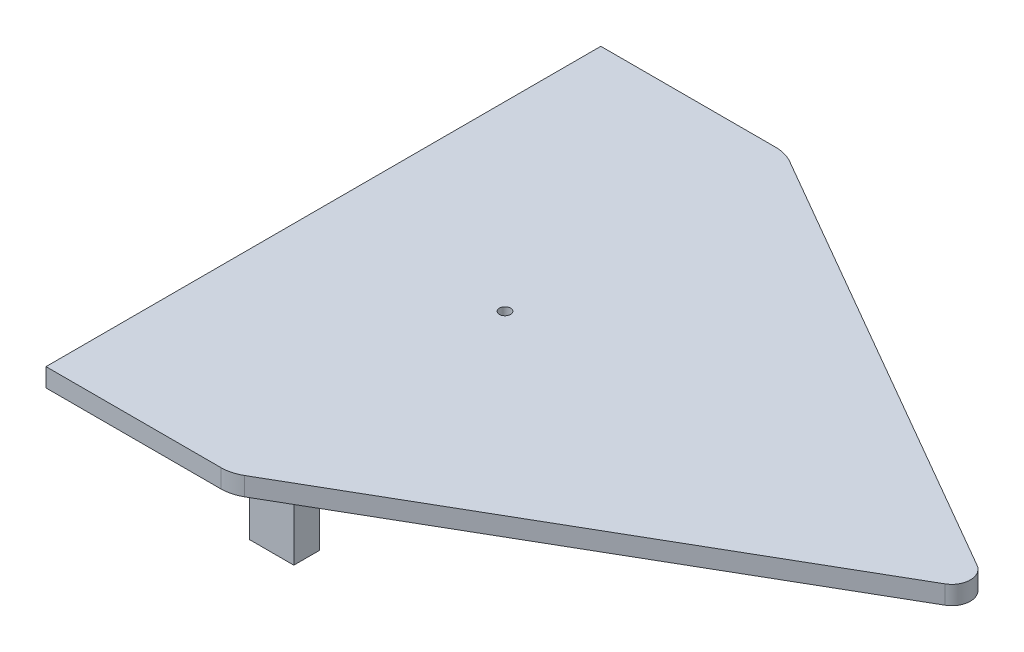
ISO-10303-21;
HEADER;
FILE_DESCRIPTION(('STEP AP214'),'2;1');
FILE_NAME('part.step','',(''),(''),'','','');
FILE_SCHEMA(('AUTOMOTIVE_DESIGN { 1 0 10303 214 1 1 1 1 }'));
ENDSEC;
DATA;
#1=APPLICATION_CONTEXT('core data for automotive mechanical design processes');
#2=APPLICATION_PROTOCOL_DEFINITION('international standard','automotive_design',2000,#1);
#3=PRODUCT_CONTEXT('',#1,'mechanical');
#4=PRODUCT('Part','Part','',(#3));
#5=PRODUCT_RELATED_PRODUCT_CATEGORY('part','',(#4));
#6=PRODUCT_DEFINITION_FORMATION('','',#4);
#7=PRODUCT_DEFINITION_CONTEXT('part definition',#1,'design');
#8=PRODUCT_DEFINITION('design','',#6,#7);
#9=PRODUCT_DEFINITION_SHAPE('','',#8);
#10=(LENGTH_UNIT() NAMED_UNIT(*) SI_UNIT(.MILLI.,.METRE.));
#11=(NAMED_UNIT(*) PLANE_ANGLE_UNIT() SI_UNIT($,.RADIAN.));
#12=(NAMED_UNIT(*) SI_UNIT($,.STERADIAN.) SOLID_ANGLE_UNIT());
#13=UNCERTAINTY_MEASURE_WITH_UNIT(LENGTH_MEASURE(1.E-05),#10,'distance_accuracy_value','');
#14=(GEOMETRIC_REPRESENTATION_CONTEXT(3) GLOBAL_UNCERTAINTY_ASSIGNED_CONTEXT((#13)) GLOBAL_UNIT_ASSIGNED_CONTEXT((#10,
#11,#12)) REPRESENTATION_CONTEXT('',''));
#15=CARTESIAN_POINT('',(0.,0.,0.));
#16=DIRECTION('',(0.,0.,1.));
#17=DIRECTION('',(1.,0.,0.));
#18=AXIS2_PLACEMENT_3D('',#15,#16,#17);
#19=CARTESIAN_POINT('',(-89.8482755730144,-48.,28.));
#20=DIRECTION('',(0.,0.,-1.));
#21=DIRECTION('',(-1.,0.,0.));
#22=AXIS2_PLACEMENT_3D('',#19,#20,#21);
#23=PLANE('',#22);
#24=DIRECTION('',(-1.,0.,0.));
#25=VECTOR('',#24,1.);
#26=CARTESIAN_POINT('',(-89.8482755730144,-18.,28.));
#27=LINE('',#26,#25);
#28=CARTESIAN_POINT('',(-81.8482755730144,-18.,28.));
#29=VERTEX_POINT('',#28);
#30=CARTESIAN_POINT('',(-85.8482755730144,-18.,28.));
#31=VERTEX_POINT('',#30);
#32=EDGE_CURVE('E11',#29,#31,#27,.T.);
#33=ORIENTED_EDGE('',*,*,#32,.T.);
#34=DIRECTION('',(0.,-1.,0.));
#35=VECTOR('',#34,1.);
#36=CARTESIAN_POINT('',(-85.8482755730144,-48.,28.));
#37=LINE('',#36,#35);
#38=CARTESIAN_POINT('',(-85.8482755730144,-48.,28.));
#39=VERTEX_POINT('',#38);
#40=EDGE_CURVE('E245',#31,#39,#37,.T.);
#41=ORIENTED_EDGE('',*,*,#40,.T.);
#42=DIRECTION('',(-1.,0.,0.));
#43=VECTOR('',#42,1.);
#44=CARTESIAN_POINT('',(-89.8482755730144,-48.,28.));
#45=LINE('',#44,#43);
#46=CARTESIAN_POINT('',(-89.8482755730144,-48.,28.));
#47=VERTEX_POINT('',#46);
#48=EDGE_CURVE('E252',#39,#47,#45,.T.);
#49=ORIENTED_EDGE('',*,*,#48,.T.);
#50=DIRECTION('',(0.,1.,0.));
#51=VECTOR('',#50,1.);
#52=CARTESIAN_POINT('',(-89.8482755730144,-48.,28.));
#53=LINE('',#52,#51);
#54=CARTESIAN_POINT('',(-89.8482755730144,-10.,28.));
#55=VERTEX_POINT('',#54);
#56=EDGE_CURVE('E270',#47,#55,#53,.T.);
#57=ORIENTED_EDGE('',*,*,#56,.T.);
#58=DIRECTION('',(-1.,0.,0.));
#59=VECTOR('',#58,1.);
#60=CARTESIAN_POINT('',(-89.8482755730144,-10.,28.));
#61=LINE('',#60,#59);
#62=CARTESIAN_POINT('',(-77.8482755730144,-10.,28.));
#63=VERTEX_POINT('',#62);
#64=EDGE_CURVE('E426',#55,#63,#61,.F.);
#65=ORIENTED_EDGE('',*,*,#64,.T.);
#66=DIRECTION('',(0.,1.,0.));
#67=VECTOR('',#66,1.);
#68=CARTESIAN_POINT('',(-77.8482755730144,-48.,28.));
#69=LINE('',#68,#67);
#70=CARTESIAN_POINT('',(-77.8482755730144,-48.,28.));
#71=VERTEX_POINT('',#70);
#72=EDGE_CURVE('E267',#71,#63,#69,.T.);
#73=ORIENTED_EDGE('',*,*,#72,.F.);
#74=CARTESIAN_POINT('',(-81.8482755730144,-48.,28.));
#75=VERTEX_POINT('',#74);
#76=EDGE_CURVE('E254',#71,#75,#45,.T.);
#77=ORIENTED_EDGE('',*,*,#76,.T.);
#78=DIRECTION('',(0.,1.,0.));
#79=VECTOR('',#78,1.);
#80=CARTESIAN_POINT('',(-81.8482755730144,-48.,28.));
#81=LINE('',#80,#79);
#82=EDGE_CURVE('E47',#75,#29,#81,.T.);
#83=ORIENTED_EDGE('',*,*,#82,.T.);
#84=EDGE_LOOP('',(#33,#41,#49,#57,#65,#73,#77,#83));
#85=FACE_BOUND('',#84,.T.);
#86=ADVANCED_FACE('F32',(#85),#23,.T.);
#87=CARTESIAN_POINT('',(0.,-48.,0.));
#88=DIRECTION('',(0.,1.,0.));
#89=DIRECTION('',(0.,0.,-1.));
#90=AXIS2_PLACEMENT_3D('',#87,#88,#89);
#91=PLANE('',#90);
#92=DIRECTION('',(0.,0.,-1.));
#93=VECTOR('',#92,1.);
#94=CARTESIAN_POINT('',(-85.8482755730144,-48.,0.));
#95=LINE('',#94,#93);
#96=CARTESIAN_POINT('',(-85.8482755730144,-48.,31.));
#97=VERTEX_POINT('',#96);
#98=EDGE_CURVE('E40',#97,#39,#95,.T.);
#99=ORIENTED_EDGE('',*,*,#98,.F.);
#100=DIRECTION('',(1.,0.,0.));
#101=VECTOR('',#100,1.);
#102=CARTESIAN_POINT('',(-85.8482755730144,-48.,31.));
#103=LINE('',#102,#101);
#104=CARTESIAN_POINT('',(-81.8482755730144,-48.,31.));
#105=VERTEX_POINT('',#104);
#106=EDGE_CURVE('E238',#97,#105,#103,.T.);
#107=ORIENTED_EDGE('',*,*,#106,.T.);
#108=DIRECTION('',(0.,0.,-1.));
#109=VECTOR('',#108,1.);
#110=CARTESIAN_POINT('',(-81.8482755730144,-48.,27.));
#111=LINE('',#110,#109);
#112=EDGE_CURVE('E232',#105,#75,#111,.T.);
#113=ORIENTED_EDGE('',*,*,#112,.T.);
#114=ORIENTED_EDGE('',*,*,#76,.F.);
#115=DIRECTION('',(0.,0.,-1.));
#116=VECTOR('',#115,1.);
#117=CARTESIAN_POINT('',(-77.8482755730144,-48.,35.));
#118=LINE('',#117,#116);
#119=CARTESIAN_POINT('',(-77.8482755730144,-48.,35.));
#120=VERTEX_POINT('',#119);
#121=EDGE_CURVE('E257',#120,#71,#118,.T.);
#122=ORIENTED_EDGE('',*,*,#121,.F.);
#123=DIRECTION('',(1.,0.,0.));
#124=VECTOR('',#123,1.);
#125=CARTESIAN_POINT('',(-89.8482755730144,-48.,35.));
#126=LINE('',#125,#124);
#127=CARTESIAN_POINT('',(-89.8482755730144,-48.,35.));
#128=VERTEX_POINT('',#127);
#129=EDGE_CURVE('E260',#128,#120,#126,.T.);
#130=ORIENTED_EDGE('',*,*,#129,.F.);
#131=DIRECTION('',(0.,0.,1.));
#132=VECTOR('',#131,1.);
#133=CARTESIAN_POINT('',(-89.8482755730144,-48.,35.));
#134=LINE('',#133,#132);
#135=EDGE_CURVE('E249',#47,#128,#134,.T.);
#136=ORIENTED_EDGE('',*,*,#135,.F.);
#137=ORIENTED_EDGE('',*,*,#48,.F.);
#138=EDGE_LOOP('',(#99,#107,#113,#114,#122,#130,#136,#137));
#139=FACE_BOUND('',#138,.T.);
#140=ADVANCED_FACE('F449',(#139),#91,.F.);
#141=CARTESIAN_POINT('',(0.,0.,0.));
#142=DIRECTION('',(0.,1.,0.));
#143=DIRECTION('',(0.,0.,1.));
#144=AXIS2_PLACEMENT_3D('',#141,#142,#143);
#145=PLANE('',#144);
#146=DIRECTION('',(0.,0.,-1.));
#147=VECTOR('',#146,1.);
#148=CARTESIAN_POINT('',(-67.8482755730145,0.,0.));
#149=LINE('',#148,#147);
#150=CARTESIAN_POINT('',(-67.8482755730145,0.,45.));
#151=VERTEX_POINT('',#150);
#152=CARTESIAN_POINT('',(-67.8482755730145,0.,18.));
#153=VERTEX_POINT('',#152);
#154=EDGE_CURVE('E421',#151,#153,#149,.T.);
#155=ORIENTED_EDGE('',*,*,#154,.T.);
#156=DIRECTION('',(-1.,0.,0.));
#157=VECTOR('',#156,1.);
#158=CARTESIAN_POINT('',(0.,0.,18.));
#159=LINE('',#158,#157);
#160=CARTESIAN_POINT('',(-99.8482755730144,0.,18.));
#161=VERTEX_POINT('',#160);
#162=EDGE_CURVE('E423',#153,#161,#159,.T.);
#163=ORIENTED_EDGE('',*,*,#162,.T.);
#164=DIRECTION('',(0.,0.,1.));
#165=VECTOR('',#164,1.);
#166=CARTESIAN_POINT('',(-99.8482755730144,0.,0.));
#167=LINE('',#166,#165);
#168=CARTESIAN_POINT('',(-99.8482755730144,0.,45.));
#169=VERTEX_POINT('',#168);
#170=EDGE_CURVE('E419',#161,#169,#167,.T.);
#171=ORIENTED_EDGE('',*,*,#170,.T.);
#172=DIRECTION('',(1.,0.,0.));
#173=VECTOR('',#172,1.);
#174=CARTESIAN_POINT('',(0.,0.,45.));
#175=LINE('',#174,#173);
#176=EDGE_CURVE('E417',#169,#151,#175,.T.);
#177=ORIENTED_EDGE('',*,*,#176,.T.);
#178=EDGE_LOOP('',(#155,#163,#171,#177));
#179=FACE_BOUND('',#178,.T.);
#180=DIRECTION('',(0.,0.,-1.));
#181=VECTOR('',#180,1.);
#182=CARTESIAN_POINT('',(-99.8482755730144,0.,-28.));
#183=LINE('',#182,#181);
#184=CARTESIAN_POINT('',(-99.8482755730144,0.,-45.));
#185=VERTEX_POINT('',#184);
#186=CARTESIAN_POINT('',(-99.8482755730144,0.,-18.));
#187=VERTEX_POINT('',#186);
#188=EDGE_CURVE('E391',#185,#187,#183,.F.);
#189=ORIENTED_EDGE('',*,*,#188,.T.);
#190=DIRECTION('',(-1.,0.,0.));
#191=VECTOR('',#190,1.);
#192=CARTESIAN_POINT('',(-77.8482755730144,0.,-18.));
#193=LINE('',#192,#191);
#194=CARTESIAN_POINT('',(-67.8482755730145,0.,-18.));
#195=VERTEX_POINT('',#194);
#196=EDGE_CURVE('E395',#187,#195,#193,.F.);
#197=ORIENTED_EDGE('',*,*,#196,.T.);
#198=DIRECTION('',(0.,0.,1.));
#199=VECTOR('',#198,1.);
#200=CARTESIAN_POINT('',(-67.8482755730145,0.,-35.));
#201=LINE('',#200,#199);
#202=CARTESIAN_POINT('',(-67.8482755730145,0.,-45.));
#203=VERTEX_POINT('',#202);
#204=EDGE_CURVE('E393',#195,#203,#201,.F.);
#205=ORIENTED_EDGE('',*,*,#204,.T.);
#206=DIRECTION('',(1.,0.,0.));
#207=VECTOR('',#206,1.);
#208=CARTESIAN_POINT('',(-89.8482755730144,0.,-45.));
#209=LINE('',#208,#207);
#210=EDGE_CURVE('E389',#203,#185,#209,.F.);
#211=ORIENTED_EDGE('',*,*,#210,.T.);
#212=EDGE_LOOP('',(#189,#197,#205,#211));
#213=FACE_BOUND('',#212,.T.);
#214=DIRECTION('',(0.866025403784438,0.,-0.5));
#215=VECTOR('',#214,1.);
#216=CARTESIAN_POINT('',(-54.8482755730144,0.,75.));
#217=LINE('',#216,#215);
#218=CARTESIAN_POINT('',(-52.5277674973257,0.,73.6602540378444));
#219=VERTEX_POINT('',#218);
#220=CARTESIAN_POINT('',(67.5555349946513,0.,4.3301270189222));
#221=VERTEX_POINT('',#220);
#222=EDGE_CURVE('E332',#219,#221,#217,.T.);
#223=ORIENTED_EDGE('',*,*,#222,.F.);
#224=CARTESIAN_POINT('',(-57.5277674973257,0.,65.));
#225=DIRECTION('',(0.,1.,0.));
#226=DIRECTION('',(0.,0.,1.));
#227=AXIS2_PLACEMENT_3D('',#224,#225,#226);
#228=CIRCLE('',#227,10.);
#229=CARTESIAN_POINT('',(-57.5277674973257,0.,75.));
#230=VERTEX_POINT('',#229);
#231=EDGE_CURVE('E380',#219,#230,#228,.F.);
#232=ORIENTED_EDGE('',*,*,#231,.T.);
#233=DIRECTION('',(-1.,0.,0.));
#234=VECTOR('',#233,1.);
#235=CARTESIAN_POINT('',(-54.8482755730144,0.,75.));
#236=LINE('',#235,#234);
#237=CARTESIAN_POINT('',(-104.848275573014,0.,75.));
#238=VERTEX_POINT('',#237);
#239=EDGE_CURVE('E349',#230,#238,#236,.T.);
#240=ORIENTED_EDGE('',*,*,#239,.T.);
#241=DIRECTION('',(0.,0.,1.));
#242=VECTOR('',#241,1.);
#243=CARTESIAN_POINT('',(-104.848275573014,0.,-75.));
#244=LINE('',#243,#242);
#245=CARTESIAN_POINT('',(-104.848275573014,0.,-75.));
#246=VERTEX_POINT('',#245);
#247=EDGE_CURVE('E346',#246,#238,#244,.T.);
#248=ORIENTED_EDGE('',*,*,#247,.F.);
#249=DIRECTION('',(-1.,0.,0.));
#250=VECTOR('',#249,1.);
#251=CARTESIAN_POINT('',(-54.8482755730144,0.,-75.));
#252=LINE('',#251,#250);
#253=CARTESIAN_POINT('',(-57.5277674973257,0.,-75.));
#254=VERTEX_POINT('',#253);
#255=EDGE_CURVE('E344',#254,#246,#252,.T.);
#256=ORIENTED_EDGE('',*,*,#255,.F.);
#257=CARTESIAN_POINT('',(-57.5277674973257,0.,-65.));
#258=DIRECTION('',(0.,1.,0.));
#259=DIRECTION('',(0.,0.,1.));
#260=AXIS2_PLACEMENT_3D('',#257,#258,#259);
#261=CIRCLE('',#260,10.);
#262=CARTESIAN_POINT('',(-52.5277674973257,0.,-73.6602540378444));
#263=VERTEX_POINT('',#262);
#264=EDGE_CURVE('E371',#254,#263,#261,.F.);
#265=ORIENTED_EDGE('',*,*,#264,.T.);
#266=DIRECTION('',(-0.866025403784439,0.,-0.5));
#267=VECTOR('',#266,1.);
#268=CARTESIAN_POINT('',(75.0555349946513,0.,0.));
#269=LINE('',#268,#267);
#270=CARTESIAN_POINT('',(67.5555349946514,0.,-4.33012701892219));
#271=VERTEX_POINT('',#270);
#272=EDGE_CURVE('E325',#271,#263,#269,.T.);
#273=ORIENTED_EDGE('',*,*,#272,.F.);
#274=CARTESIAN_POINT('',(65.0555349946513,0.,0.));
#275=DIRECTION('',(0.,1.,0.));
#276=DIRECTION('',(0.,0.,1.));
#277=AXIS2_PLACEMENT_3D('',#274,#275,#276);
#278=CIRCLE('',#277,5.);
#279=EDGE_CURVE('E360',#271,#221,#278,.F.);
#280=ORIENTED_EDGE('',*,*,#279,.T.);
#281=EDGE_LOOP('',(#223,#232,#240,#248,#256,#265,#273,#280));
#282=FACE_BOUND('',#281,.T.);
#283=ADVANCED_FACE('F468',(#179,#213,#282),#145,.F.);
#284=CARTESIAN_POINT('',(75.0555349946513,5.,0.));
#285=DIRECTION('',(-0.5,0.,0.866025403784439));
#286=DIRECTION('',(0.866025403784439,0.,0.5));
#287=AXIS2_PLACEMENT_3D('',#284,#285,#286);
#288=PLANE('',#287);
#289=ORIENTED_EDGE('',*,*,#272,.T.);
#290=DIRECTION('',(0.,-1.,0.));
#291=VECTOR('',#290,1.);
#292=CARTESIAN_POINT('',(-52.5277674973257,5.,-73.6602540378444));
#293=LINE('',#292,#291);
#294=CARTESIAN_POINT('',(-52.5277674973257,5.,-73.6602540378444));
#295=VERTEX_POINT('',#294);
#296=EDGE_CURVE('E373',#263,#295,#293,.F.);
#297=ORIENTED_EDGE('',*,*,#296,.T.);
#298=DIRECTION('',(-0.866025403784439,0.,-0.5));
#299=VECTOR('',#298,1.);
#300=CARTESIAN_POINT('',(75.0555349946513,5.,0.));
#301=LINE('',#300,#299);
#302=CARTESIAN_POINT('',(67.5555349946514,5.,-4.33012701892219));
#303=VERTEX_POINT('',#302);
#304=EDGE_CURVE('E328',#303,#295,#301,.T.);
#305=ORIENTED_EDGE('',*,*,#304,.F.);
#306=DIRECTION('',(0.,-1.,0.));
#307=VECTOR('',#306,1.);
#308=CARTESIAN_POINT('',(67.5555349946514,5.,-4.33012701892219));
#309=LINE('',#308,#307);
#310=EDGE_CURVE('E357',#303,#271,#309,.T.);
#311=ORIENTED_EDGE('',*,*,#310,.T.);
#312=EDGE_LOOP('',(#289,#297,#305,#311));
#313=FACE_BOUND('',#312,.T.);
#314=ADVANCED_FACE('F549',(#313),#288,.F.);
#315=CARTESIAN_POINT('',(-54.8482755730144,5.,-75.));
#316=DIRECTION('',(0.,0.,1.));
#317=DIRECTION('',(1.,0.,0.));
#318=AXIS2_PLACEMENT_3D('',#315,#316,#317);
#319=PLANE('',#318);
#320=DIRECTION('',(-1.,0.,0.));
#321=VECTOR('',#320,1.);
#322=CARTESIAN_POINT('',(-54.8482755730144,5.,-75.));
#323=LINE('',#322,#321);
#324=CARTESIAN_POINT('',(-57.5277674973257,5.,-75.));
#325=VERTEX_POINT('',#324);
#326=CARTESIAN_POINT('',(-104.848275573014,5.,-75.));
#327=VERTEX_POINT('',#326);
#328=EDGE_CURVE('E331',#325,#327,#323,.T.);
#329=ORIENTED_EDGE('',*,*,#328,.F.);
#330=DIRECTION('',(0.,-1.,0.));
#331=VECTOR('',#330,1.);
#332=CARTESIAN_POINT('',(-57.5277674973257,5.,-75.));
#333=LINE('',#332,#331);
#334=EDGE_CURVE('E368',#325,#254,#333,.T.);
#335=ORIENTED_EDGE('',*,*,#334,.T.);
#336=ORIENTED_EDGE('',*,*,#255,.T.);
#337=DIRECTION('',(0.,-1.,0.));
#338=VECTOR('',#337,1.);
#339=CARTESIAN_POINT('',(-104.848275573014,5.,-75.));
#340=LINE('',#339,#338);
#341=EDGE_CURVE('E354',#327,#246,#340,.T.);
#342=ORIENTED_EDGE('',*,*,#341,.F.);
#343=EDGE_LOOP('',(#329,#335,#336,#342));
#344=FACE_BOUND('',#343,.T.);
#345=ADVANCED_FACE('F560',(#344),#319,.F.);
#346=CARTESIAN_POINT('',(-104.848275573014,5.,-75.));
#347=DIRECTION('',(1.,0.,0.));
#348=DIRECTION('',(0.,0.,-1.));
#349=AXIS2_PLACEMENT_3D('',#346,#347,#348);
#350=PLANE('',#349);
#351=ORIENTED_EDGE('',*,*,#247,.T.);
#352=DIRECTION('',(0.,-1.,0.));
#353=VECTOR('',#352,1.);
#354=CARTESIAN_POINT('',(-104.848275573014,5.,75.));
#355=LINE('',#354,#353);
#356=CARTESIAN_POINT('',(-104.848275573014,5.,75.));
#357=VERTEX_POINT('',#356);
#358=EDGE_CURVE('E341',#357,#238,#355,.T.);
#359=ORIENTED_EDGE('',*,*,#358,.F.);
#360=DIRECTION('',(0.,0.,1.));
#361=VECTOR('',#360,1.);
#362=CARTESIAN_POINT('',(-104.848275573014,5.,-75.));
#363=LINE('',#362,#361);
#364=EDGE_CURVE('E334',#327,#357,#363,.T.);
#365=ORIENTED_EDGE('',*,*,#364,.F.);
#366=ORIENTED_EDGE('',*,*,#341,.T.);
#367=EDGE_LOOP('',(#351,#359,#365,#366));
#368=FACE_BOUND('',#367,.T.);
#369=ADVANCED_FACE('F556',(#368),#350,.F.);
#370=CARTESIAN_POINT('',(-54.8482755730144,5.,75.));
#371=DIRECTION('',(0.,0.,1.));
#372=DIRECTION('',(1.,0.,0.));
#373=AXIS2_PLACEMENT_3D('',#370,#371,#372);
#374=PLANE('',#373);
#375=ORIENTED_EDGE('',*,*,#239,.F.);
#376=DIRECTION('',(0.,-1.,0.));
#377=VECTOR('',#376,1.);
#378=CARTESIAN_POINT('',(-57.5277674973257,5.,75.));
#379=LINE('',#378,#377);
#380=CARTESIAN_POINT('',(-57.5277674973257,5.,75.));
#381=VERTEX_POINT('',#380);
#382=EDGE_CURVE('E382',#230,#381,#379,.F.);
#383=ORIENTED_EDGE('',*,*,#382,.T.);
#384=DIRECTION('',(-1.,0.,0.));
#385=VECTOR('',#384,1.);
#386=CARTESIAN_POINT('',(-54.8482755730144,5.,75.));
#387=LINE('',#386,#385);
#388=EDGE_CURVE('E337',#381,#357,#387,.T.);
#389=ORIENTED_EDGE('',*,*,#388,.T.);
#390=ORIENTED_EDGE('',*,*,#358,.T.);
#391=EDGE_LOOP('',(#375,#383,#389,#390));
#392=FACE_BOUND('',#391,.T.);
#393=ADVANCED_FACE('F552',(#392),#374,.T.);
#394=CARTESIAN_POINT('',(-54.8482755730144,5.,75.));
#395=DIRECTION('',(-0.5,0.,-0.866025403784439));
#396=DIRECTION('',(-0.866025403784439,0.,0.5));
#397=AXIS2_PLACEMENT_3D('',#394,#395,#396);
#398=PLANE('',#397);
#399=DIRECTION('',(0.866025403784438,0.,-0.5));
#400=VECTOR('',#399,1.);
#401=CARTESIAN_POINT('',(-54.8482755730144,5.,75.));
#402=LINE('',#401,#400);
#403=CARTESIAN_POINT('',(-52.5277674973257,5.,73.6602540378444));
#404=VERTEX_POINT('',#403);
#405=CARTESIAN_POINT('',(67.5555349946513,5.,4.3301270189222));
#406=VERTEX_POINT('',#405);
#407=EDGE_CURVE('E339',#404,#406,#402,.T.);
#408=ORIENTED_EDGE('',*,*,#407,.F.);
#409=DIRECTION('',(0.,-1.,0.));
#410=VECTOR('',#409,1.);
#411=CARTESIAN_POINT('',(-52.5277674973257,0.,73.6602540378444));
#412=LINE('',#411,#410);
#413=EDGE_CURVE('E377',#404,#219,#412,.T.);
#414=ORIENTED_EDGE('',*,*,#413,.T.);
#415=ORIENTED_EDGE('',*,*,#222,.T.);
#416=DIRECTION('',(0.,-1.,0.));
#417=VECTOR('',#416,1.);
#418=CARTESIAN_POINT('',(67.5555349946514,5.,4.33012701892217));
#419=LINE('',#418,#417);
#420=EDGE_CURVE('E363',#221,#406,#419,.F.);
#421=ORIENTED_EDGE('',*,*,#420,.T.);
#422=EDGE_LOOP('',(#408,#414,#415,#421));
#423=FACE_BOUND('',#422,.T.);
#424=ADVANCED_FACE('F545',(#423),#398,.F.);
#425=CARTESIAN_POINT('',(0.,5.,0.));
#426=DIRECTION('',(0.,1.,0.));
#427=DIRECTION('',(0.,0.,1.));
#428=AXIS2_PLACEMENT_3D('',#425,#426,#427);
#429=PLANE('',#428);
#430=CARTESIAN_POINT('',(-55.7544650053487,5.,0.));
#431=DIRECTION('',(0.,1.,0.));
#432=DIRECTION('',(0.,0.,1.));
#433=AXIS2_PLACEMENT_3D('',#430,#431,#432);
#434=CIRCLE('',#433,1.5);
#435=CARTESIAN_POINT('',(-55.7544650053487,5.,1.50000000000001));
#436=VERTEX_POINT('',#435);
#437=EDGE_CURVE('E321',#436,#436,#434,.T.);
#438=ORIENTED_EDGE('',*,*,#437,.F.);
#439=EDGE_LOOP('',(#438));
#440=FACE_BOUND('',#439,.T.);
#441=ORIENTED_EDGE('',*,*,#388,.F.);
#442=CARTESIAN_POINT('',(-57.5277674973257,5.,65.));
#443=DIRECTION('',(0.,1.,0.));
#444=DIRECTION('',(0.,0.,1.));
#445=AXIS2_PLACEMENT_3D('',#442,#443,#444);
#446=CIRCLE('',#445,10.);
#447=EDGE_CURVE('E384',#381,#404,#446,.T.);
#448=ORIENTED_EDGE('',*,*,#447,.T.);
#449=ORIENTED_EDGE('',*,*,#407,.T.);
#450=CARTESIAN_POINT('',(65.0555349946513,5.,0.));
#451=DIRECTION('',(0.,1.,0.));
#452=DIRECTION('',(0.,0.,1.));
#453=AXIS2_PLACEMENT_3D('',#450,#451,#452);
#454=CIRCLE('',#453,5.);
#455=EDGE_CURVE('E366',#406,#303,#454,.T.);
#456=ORIENTED_EDGE('',*,*,#455,.T.);
#457=ORIENTED_EDGE('',*,*,#304,.T.);
#458=CARTESIAN_POINT('',(-57.5277674973257,5.,-65.));
#459=DIRECTION('',(0.,1.,0.));
#460=DIRECTION('',(0.,0.,1.));
#461=AXIS2_PLACEMENT_3D('',#458,#459,#460);
#462=CIRCLE('',#461,10.);
#463=EDGE_CURVE('E375',#295,#325,#462,.T.);
#464=ORIENTED_EDGE('',*,*,#463,.T.);
#465=ORIENTED_EDGE('',*,*,#328,.T.);
#466=ORIENTED_EDGE('',*,*,#364,.T.);
#467=EDGE_LOOP('',(#441,#448,#449,#456,#457,#464,#465,#466));
#468=FACE_BOUND('',#467,.T.);
#469=ADVANCED_FACE('F541',(#440,#468),#429,.T.);
#470=CARTESIAN_POINT('',(65.0555349946513,5.,0.));
#471=DIRECTION('',(0.,-1.,0.));
#472=DIRECTION('',(0.,0.,-1.));
#473=AXIS2_PLACEMENT_3D('',#470,#471,#472);
#474=CYLINDRICAL_SURFACE('',#473,5.);
#475=ORIENTED_EDGE('',*,*,#455,.F.);
#476=ORIENTED_EDGE('',*,*,#420,.F.);
#477=ORIENTED_EDGE('',*,*,#279,.F.);
#478=ORIENTED_EDGE('',*,*,#310,.F.);
#479=EDGE_LOOP('',(#475,#476,#477,#478));
#480=FACE_BOUND('',#479,.T.);
#481=ADVANCED_FACE('F544',(#480),#474,.T.);
#482=CARTESIAN_POINT('',(-57.5277674973257,5.,-65.));
#483=DIRECTION('',(0.,-1.,0.));
#484=DIRECTION('',(0.,0.,-1.));
#485=AXIS2_PLACEMENT_3D('',#482,#483,#484);
#486=CYLINDRICAL_SURFACE('',#485,10.);
#487=ORIENTED_EDGE('',*,*,#463,.F.);
#488=ORIENTED_EDGE('',*,*,#296,.F.);
#489=ORIENTED_EDGE('',*,*,#264,.F.);
#490=ORIENTED_EDGE('',*,*,#334,.F.);
#491=EDGE_LOOP('',(#487,#488,#489,#490));
#492=FACE_BOUND('',#491,.T.);
#493=ADVANCED_FACE('F570',(#492),#486,.T.);
#494=CARTESIAN_POINT('',(-57.5277674973257,5.,65.));
#495=DIRECTION('',(0.,1.,0.));
#496=DIRECTION('',(0.,0.,1.));
#497=AXIS2_PLACEMENT_3D('',#494,#495,#496);
#498=CYLINDRICAL_SURFACE('',#497,10.);
#499=ORIENTED_EDGE('',*,*,#447,.F.);
#500=ORIENTED_EDGE('',*,*,#382,.F.);
#501=ORIENTED_EDGE('',*,*,#231,.F.);
#502=ORIENTED_EDGE('',*,*,#413,.F.);
#503=EDGE_LOOP('',(#499,#500,#501,#502));
#504=FACE_BOUND('',#503,.T.);
#505=ADVANCED_FACE('F539',(#504),#498,.T.);
#506=CARTESIAN_POINT('',(-55.7544650053487,1.5,0.));
#507=DIRECTION('',(0.,1.,0.));
#508=DIRECTION('',(0.,0.,1.));
#509=AXIS2_PLACEMENT_3D('',#506,#507,#508);
#510=CYLINDRICAL_SURFACE('',#509,1.5);
#511=CARTESIAN_POINT('',(-55.7544650053487,1.5,0.));
#512=DIRECTION('',(0.,1.,0.));
#513=DIRECTION('',(0.,0.,1.));
#514=AXIS2_PLACEMENT_3D('',#511,#512,#513);
#515=CIRCLE('',#514,1.5);
#516=CARTESIAN_POINT('',(-55.7544650053487,1.5,1.50000000000001));
#517=VERTEX_POINT('',#516);
#518=EDGE_CURVE('E322',#517,#517,#515,.T.);
#519=ORIENTED_EDGE('',*,*,#518,.F.);
#520=EDGE_LOOP('',(#519));
#521=FACE_BOUND('',#520,.T.);
#522=ORIENTED_EDGE('',*,*,#437,.T.);
#523=EDGE_LOOP('',(#522));
#524=FACE_BOUND('',#523,.T.);
#525=ADVANCED_FACE('F535',(#521,#524),#510,.F.);
#526=CARTESIAN_POINT('',(-55.7544650053487,1.5,0.));
#527=DIRECTION('',(0.,1.,0.));
#528=DIRECTION('',(0.,0.,1.));
#529=AXIS2_PLACEMENT_3D('',#526,#527,#528);
#530=PLANE('',#529);
#531=ORIENTED_EDGE('',*,*,#518,.T.);
#532=EDGE_LOOP('',(#531));
#533=FACE_BOUND('',#532,.T.);
#534=ADVANCED_FACE('F531',(#533),#530,.T.);
#535=CARTESIAN_POINT('',(-89.8482755730144,-48.,-35.));
#536=DIRECTION('',(1.,0.,0.));
#537=DIRECTION('',(0.,0.,-1.));
#538=AXIS2_PLACEMENT_3D('',#535,#536,#537);
#539=PLANE('',#538);
#540=DIRECTION('',(0.,1.,0.));
#541=VECTOR('',#540,1.);
#542=CARTESIAN_POINT('',(-89.8482755730144,-48.,-28.));
#543=LINE('',#542,#541);
#544=CARTESIAN_POINT('',(-89.8482755730144,-48.,-28.));
#545=VERTEX_POINT('',#544);
#546=CARTESIAN_POINT('',(-89.8482755730144,-10.,-28.));
#547=VERTEX_POINT('',#546);
#548=EDGE_CURVE('E309',#545,#547,#543,.T.);
#549=ORIENTED_EDGE('',*,*,#548,.T.);
#550=DIRECTION('',(0.,0.,-1.));
#551=VECTOR('',#550,1.);
#552=CARTESIAN_POINT('',(-89.8482755730144,-10.,-35.));
#553=LINE('',#552,#551);
#554=CARTESIAN_POINT('',(-89.8482755730144,-10.,-35.));
#555=VERTEX_POINT('',#554);
#556=EDGE_CURVE('E400',#547,#555,#553,.T.);
#557=ORIENTED_EDGE('',*,*,#556,.T.);
#558=DIRECTION('',(0.,1.,0.));
#559=VECTOR('',#558,1.);
#560=CARTESIAN_POINT('',(-89.8482755730144,-48.,-35.));
#561=LINE('',#560,#559);
#562=CARTESIAN_POINT('',(-89.8482755730144,-48.,-35.));
#563=VERTEX_POINT('',#562);
#564=EDGE_CURVE('E318',#563,#555,#561,.T.);
#565=ORIENTED_EDGE('',*,*,#564,.F.);
#566=DIRECTION('',(0.,0.,-1.));
#567=VECTOR('',#566,1.);
#568=CARTESIAN_POINT('',(-89.8482755730144,-48.,-35.));
#569=LINE('',#568,#567);
#570=EDGE_CURVE('E297',#545,#563,#569,.T.);
#571=ORIENTED_EDGE('',*,*,#570,.F.);
#572=EDGE_LOOP('',(#549,#557,#565,#571));
#573=FACE_BOUND('',#572,.T.);
#574=ADVANCED_FACE('F527',(#573),#539,.F.);
#575=CARTESIAN_POINT('',(-89.8482755730144,-48.,-35.));
#576=DIRECTION('',(0.,0.,1.));
#577=DIRECTION('',(1.,0.,0.));
#578=AXIS2_PLACEMENT_3D('',#575,#576,#577);
#579=PLANE('',#578);
#580=ORIENTED_EDGE('',*,*,#564,.T.);
#581=DIRECTION('',(1.,0.,0.));
#582=VECTOR('',#581,1.);
#583=CARTESIAN_POINT('',(-77.8482755730144,-10.,-35.));
#584=LINE('',#583,#582);
#585=CARTESIAN_POINT('',(-77.8482755730144,-10.,-35.));
#586=VERTEX_POINT('',#585);
#587=EDGE_CURVE('E402',#555,#586,#584,.T.);
#588=ORIENTED_EDGE('',*,*,#587,.T.);
#589=DIRECTION('',(0.,1.,0.));
#590=VECTOR('',#589,1.);
#591=CARTESIAN_POINT('',(-77.8482755730144,-48.,-35.));
#592=LINE('',#591,#590);
#593=CARTESIAN_POINT('',(-77.8482755730144,-48.,-35.));
#594=VERTEX_POINT('',#593);
#595=EDGE_CURVE('E315',#594,#586,#592,.T.);
#596=ORIENTED_EDGE('',*,*,#595,.F.);
#597=DIRECTION('',(1.,0.,0.));
#598=VECTOR('',#597,1.);
#599=CARTESIAN_POINT('',(-89.8482755730144,-48.,-35.));
#600=LINE('',#599,#598);
#601=EDGE_CURVE('E300',#563,#594,#600,.T.);
#602=ORIENTED_EDGE('',*,*,#601,.F.);
#603=EDGE_LOOP('',(#580,#588,#596,#602));
#604=FACE_BOUND('',#603,.T.);
#605=ADVANCED_FACE('F523',(#604),#579,.F.);
#606=CARTESIAN_POINT('',(-77.8482755730144,-48.,-35.));
#607=DIRECTION('',(-1.,0.,0.));
#608=DIRECTION('',(0.,0.,1.));
#609=AXIS2_PLACEMENT_3D('',#606,#607,#608);
#610=PLANE('',#609);
#611=ORIENTED_EDGE('',*,*,#595,.T.);
#612=DIRECTION('',(0.,0.,1.));
#613=VECTOR('',#612,1.);
#614=CARTESIAN_POINT('',(-77.8482755730144,-10.,-28.));
#615=LINE('',#614,#613);
#616=CARTESIAN_POINT('',(-77.8482755730144,-10.,-28.));
#617=VERTEX_POINT('',#616);
#618=EDGE_CURVE('E398',#586,#617,#615,.T.);
#619=ORIENTED_EDGE('',*,*,#618,.T.);
#620=DIRECTION('',(0.,1.,0.));
#621=VECTOR('',#620,1.);
#622=CARTESIAN_POINT('',(-77.8482755730144,-48.,-28.));
#623=LINE('',#622,#621);
#624=CARTESIAN_POINT('',(-77.8482755730144,-48.,-28.));
#625=VERTEX_POINT('',#624);
#626=EDGE_CURVE('E312',#625,#617,#623,.T.);
#627=ORIENTED_EDGE('',*,*,#626,.F.);
#628=DIRECTION('',(0.,0.,1.));
#629=VECTOR('',#628,1.);
#630=CARTESIAN_POINT('',(-77.8482755730144,-48.,-35.));
#631=LINE('',#630,#629);
#632=EDGE_CURVE('E303',#594,#625,#631,.T.);
#633=ORIENTED_EDGE('',*,*,#632,.F.);
#634=EDGE_LOOP('',(#611,#619,#627,#633));
#635=FACE_BOUND('',#634,.T.);
#636=ADVANCED_FACE('F519',(#635),#610,.F.);
#637=CARTESIAN_POINT('',(-89.8482755730144,-48.,-28.));
#638=DIRECTION('',(0.,0.,-1.));
#639=DIRECTION('',(-1.,0.,0.));
#640=AXIS2_PLACEMENT_3D('',#637,#638,#639);
#641=PLANE('',#640);
#642=DIRECTION('',(-1.,0.,0.));
#643=VECTOR('',#642,1.);
#644=CARTESIAN_POINT('',(-89.8482755730144,-48.,-28.));
#645=LINE('',#644,#643);
#646=CARTESIAN_POINT('',(-85.8482755730144,-48.,-28.));
#647=VERTEX_POINT('',#646);
#648=EDGE_CURVE('E305',#647,#545,#645,.T.);
#649=ORIENTED_EDGE('',*,*,#648,.F.);
#650=DIRECTION('',(0.,1.,0.));
#651=VECTOR('',#650,1.);
#652=CARTESIAN_POINT('',(-85.8482755730144,-48.,-28.));
#653=LINE('',#652,#651);
#654=CARTESIAN_POINT('',(-85.8482755730144,-18.,-28.));
#655=VERTEX_POINT('',#654);
#656=EDGE_CURVE('E293',#647,#655,#653,.T.);
#657=ORIENTED_EDGE('',*,*,#656,.T.);
#658=DIRECTION('',(-1.,0.,0.));
#659=VECTOR('',#658,1.);
#660=CARTESIAN_POINT('',(-89.8482755730144,-18.,-28.));
#661=LINE('',#660,#659);
#662=CARTESIAN_POINT('',(-81.8482755730144,-18.,-28.));
#663=VERTEX_POINT('',#662);
#664=EDGE_CURVE('E415',#663,#655,#661,.T.);
#665=ORIENTED_EDGE('',*,*,#664,.F.);
#666=DIRECTION('',(0.,-1.,0.));
#667=VECTOR('',#666,1.);
#668=CARTESIAN_POINT('',(-81.8482755730144,-48.,-28.));
#669=LINE('',#668,#667);
#670=CARTESIAN_POINT('',(-81.8482755730144,-48.,-28.));
#671=VERTEX_POINT('',#670);
#672=EDGE_CURVE('E289',#663,#671,#669,.T.);
#673=ORIENTED_EDGE('',*,*,#672,.T.);
#674=EDGE_CURVE('E306',#625,#671,#645,.T.);
#675=ORIENTED_EDGE('',*,*,#674,.F.);
#676=ORIENTED_EDGE('',*,*,#626,.T.);
#677=DIRECTION('',(-1.,0.,0.));
#678=VECTOR('',#677,1.);
#679=CARTESIAN_POINT('',(-89.8482755730144,-10.,-28.));
#680=LINE('',#679,#678);
#681=EDGE_CURVE('E386',#617,#547,#680,.T.);
#682=ORIENTED_EDGE('',*,*,#681,.T.);
#683=ORIENTED_EDGE('',*,*,#548,.F.);
#684=EDGE_LOOP('',(#649,#657,#665,#673,#675,#676,#682,#683));
#685=FACE_BOUND('',#684,.T.);
#686=ADVANCED_FACE('F515',(#685),#641,.F.);
#687=CARTESIAN_POINT('',(0.,-48.,0.));
#688=DIRECTION('',(0.,1.,0.));
#689=DIRECTION('',(0.,0.,1.));
#690=AXIS2_PLACEMENT_3D('',#687,#688,#689);
#691=PLANE('',#690);
#692=DIRECTION('',(1.,0.,0.));
#693=VECTOR('',#692,1.);
#694=CARTESIAN_POINT('',(-85.8482755730144,-48.,-31.));
#695=LINE('',#694,#693);
#696=CARTESIAN_POINT('',(-85.8482755730144,-48.,-31.));
#697=VERTEX_POINT('',#696);
#698=CARTESIAN_POINT('',(-81.8482755730144,-48.,-31.));
#699=VERTEX_POINT('',#698);
#700=EDGE_CURVE('E273',#697,#699,#695,.T.);
#701=ORIENTED_EDGE('',*,*,#700,.F.);
#702=DIRECTION('',(0.,0.,1.));
#703=VECTOR('',#702,1.);
#704=CARTESIAN_POINT('',(-85.8482755730144,-48.,0.));
#705=LINE('',#704,#703);
#706=EDGE_CURVE('E404',#697,#647,#705,.T.);
#707=ORIENTED_EDGE('',*,*,#706,.T.);
#708=ORIENTED_EDGE('',*,*,#648,.T.);
#709=ORIENTED_EDGE('',*,*,#570,.T.);
#710=ORIENTED_EDGE('',*,*,#601,.T.);
#711=ORIENTED_EDGE('',*,*,#632,.T.);
#712=ORIENTED_EDGE('',*,*,#674,.T.);
#713=DIRECTION('',(0.,0.,1.));
#714=VECTOR('',#713,1.);
#715=CARTESIAN_POINT('',(-81.8482755730144,-48.,-27.));
#716=LINE('',#715,#714);
#717=EDGE_CURVE('E277',#699,#671,#716,.T.);
#718=ORIENTED_EDGE('',*,*,#717,.F.);
#719=EDGE_LOOP('',(#701,#707,#708,#709,#710,#711,#712,#718));
#720=FACE_BOUND('',#719,.T.);
#721=ADVANCED_FACE('F511',(#720),#691,.F.);
#722=CARTESIAN_POINT('',(-89.8482755730144,-10.,-45.));
#723=DIRECTION('',(-1.,0.,0.));
#724=DIRECTION('',(0.,0.,1.));
#725=AXIS2_PLACEMENT_3D('',#722,#723,#724);
#726=CYLINDRICAL_SURFACE('',#725,10.);
#727=CARTESIAN_POINT('',(-99.8482755730144,-10.,-45.));
#728=DIRECTION('',(-0.707106781186547,0.,0.707106781186547));
#729=DIRECTION('',(-0.707106781186547,0.,-0.707106781186547));
#730=AXIS2_PLACEMENT_3D('',#727,#728,#729);
#731=ELLIPSE('',#730,14.1421356237309,10.);
#732=EDGE_CURVE('E408',#185,#555,#731,.F.);
#733=ORIENTED_EDGE('',*,*,#732,.F.);
#734=ORIENTED_EDGE('',*,*,#210,.F.);
#735=CARTESIAN_POINT('',(-67.8482755730145,-10.,-45.));
#736=DIRECTION('',(-0.707106781186547,0.,-0.707106781186547));
#737=DIRECTION('',(-0.707106781186547,0.,0.707106781186547));
#738=AXIS2_PLACEMENT_3D('',#735,#736,#737);
#739=ELLIPSE('',#738,14.1421356237309,10.);
#740=EDGE_CURVE('E301',#586,#203,#739,.T.);
#741=ORIENTED_EDGE('',*,*,#740,.F.);
#742=ORIENTED_EDGE('',*,*,#587,.F.);
#743=EDGE_LOOP('',(#733,#734,#741,#742));
#744=FACE_BOUND('',#743,.T.);
#745=ADVANCED_FACE('F514',(#744),#726,.F.);
#746=CARTESIAN_POINT('',(-67.8482755730145,-10.,-35.));
#747=DIRECTION('',(0.,0.,-1.));
#748=DIRECTION('',(-1.,0.,0.));
#749=AXIS2_PLACEMENT_3D('',#746,#747,#748);
#750=CYLINDRICAL_SURFACE('',#749,10.);
#751=ORIENTED_EDGE('',*,*,#740,.T.);
#752=ORIENTED_EDGE('',*,*,#204,.F.);
#753=CARTESIAN_POINT('',(-67.8482755730145,-10.,-18.));
#754=DIRECTION('',(0.707106781186547,0.,-0.707106781186547));
#755=DIRECTION('',(-0.707106781186547,0.,-0.707106781186547));
#756=AXIS2_PLACEMENT_3D('',#753,#754,#755);
#757=ELLIPSE('',#756,14.1421356237309,10.);
#758=EDGE_CURVE('E406',#617,#195,#757,.T.);
#759=ORIENTED_EDGE('',*,*,#758,.F.);
#760=ORIENTED_EDGE('',*,*,#618,.F.);
#761=EDGE_LOOP('',(#751,#752,#759,#760));
#762=FACE_BOUND('',#761,.T.);
#763=ADVANCED_FACE('F584',(#762),#750,.F.);
#764=CARTESIAN_POINT('',(-99.8482755730144,-10.,-35.));
#765=DIRECTION('',(0.,0.,1.));
#766=DIRECTION('',(1.,0.,0.));
#767=AXIS2_PLACEMENT_3D('',#764,#765,#766);
#768=CYLINDRICAL_SURFACE('',#767,10.);
#769=ORIENTED_EDGE('',*,*,#732,.T.);
#770=ORIENTED_EDGE('',*,*,#556,.F.);
#771=CARTESIAN_POINT('',(-99.8482755730144,-10.,-18.));
#772=DIRECTION('',(0.707106781186547,0.,0.707106781186547));
#773=DIRECTION('',(-0.707106781186547,0.,0.707106781186547));
#774=AXIS2_PLACEMENT_3D('',#771,#772,#773);
#775=ELLIPSE('',#774,14.1421356237309,10.);
#776=EDGE_CURVE('E296',#187,#547,#775,.F.);
#777=ORIENTED_EDGE('',*,*,#776,.F.);
#778=ORIENTED_EDGE('',*,*,#188,.F.);
#779=EDGE_LOOP('',(#769,#770,#777,#778));
#780=FACE_BOUND('',#779,.T.);
#781=ADVANCED_FACE('F580',(#780),#768,.F.);
#782=CARTESIAN_POINT('',(-89.8482755730144,-10.,-18.));
#783=DIRECTION('',(1.,0.,0.));
#784=DIRECTION('',(0.,0.,-1.));
#785=AXIS2_PLACEMENT_3D('',#782,#783,#784);
#786=CYLINDRICAL_SURFACE('',#785,10.);
#787=ORIENTED_EDGE('',*,*,#758,.T.);
#788=ORIENTED_EDGE('',*,*,#196,.F.);
#789=ORIENTED_EDGE('',*,*,#776,.T.);
#790=ORIENTED_EDGE('',*,*,#681,.F.);
#791=EDGE_LOOP('',(#787,#788,#789,#790));
#792=FACE_BOUND('',#791,.T.);
#793=ADVANCED_FACE('F499',(#792),#786,.F.);
#794=CARTESIAN_POINT('',(0.,-18.,0.));
#795=DIRECTION('',(0.,-1.,0.));
#796=DIRECTION('',(0.,0.,-1.));
#797=AXIS2_PLACEMENT_3D('',#794,#795,#796);
#798=PLANE('',#797);
#799=ORIENTED_EDGE('',*,*,#664,.T.);
#800=DIRECTION('',(0.,0.,-1.));
#801=VECTOR('',#800,1.);
#802=CARTESIAN_POINT('',(-85.8482755730144,-18.,-27.));
#803=LINE('',#802,#801);
#804=CARTESIAN_POINT('',(-85.8482755730144,-18.,-31.));
#805=VERTEX_POINT('',#804);
#806=EDGE_CURVE('E274',#655,#805,#803,.T.);
#807=ORIENTED_EDGE('',*,*,#806,.T.);
#808=DIRECTION('',(1.,0.,0.));
#809=VECTOR('',#808,1.);
#810=CARTESIAN_POINT('',(-85.8482755730144,-18.,-31.));
#811=LINE('',#810,#809);
#812=CARTESIAN_POINT('',(-81.8482755730144,-18.,-31.));
#813=VERTEX_POINT('',#812);
#814=EDGE_CURVE('E276',#805,#813,#811,.T.);
#815=ORIENTED_EDGE('',*,*,#814,.T.);
#816=DIRECTION('',(0.,0.,1.));
#817=VECTOR('',#816,1.);
#818=CARTESIAN_POINT('',(-81.8482755730144,-18.,-27.));
#819=LINE('',#818,#817);
#820=EDGE_CURVE('E280',#813,#663,#819,.T.);
#821=ORIENTED_EDGE('',*,*,#820,.T.);
#822=EDGE_LOOP('',(#799,#807,#815,#821));
#823=FACE_BOUND('',#822,.T.);
#824=ADVANCED_FACE('F495',(#823),#798,.T.);
#825=CARTESIAN_POINT('',(-85.8482755730144,-18.,-27.));
#826=DIRECTION('',(-1.,0.,0.));
#827=DIRECTION('',(0.,0.,1.));
#828=AXIS2_PLACEMENT_3D('',#825,#826,#827);
#829=PLANE('',#828);
#830=ORIENTED_EDGE('',*,*,#706,.F.);
#831=DIRECTION('',(0.,-1.,0.));
#832=VECTOR('',#831,1.);
#833=CARTESIAN_POINT('',(-85.8482755730144,-18.,-31.));
#834=LINE('',#833,#832);
#835=EDGE_CURVE('E283',#805,#697,#834,.T.);
#836=ORIENTED_EDGE('',*,*,#835,.F.);
#837=ORIENTED_EDGE('',*,*,#806,.F.);
#838=ORIENTED_EDGE('',*,*,#656,.F.);
#839=EDGE_LOOP('',(#830,#836,#837,#838));
#840=FACE_BOUND('',#839,.T.);
#841=ADVANCED_FACE('F498',(#840),#829,.F.);
#842=CARTESIAN_POINT('',(-81.8482755730144,-18.,-27.));
#843=DIRECTION('',(1.,0.,0.));
#844=DIRECTION('',(0.,0.,-1.));
#845=AXIS2_PLACEMENT_3D('',#842,#843,#844);
#846=PLANE('',#845);
#847=ORIENTED_EDGE('',*,*,#820,.F.);
#848=DIRECTION('',(0.,-1.,0.));
#849=VECTOR('',#848,1.);
#850=CARTESIAN_POINT('',(-81.8482755730144,-18.,-31.));
#851=LINE('',#850,#849);
#852=EDGE_CURVE('E287',#813,#699,#851,.T.);
#853=ORIENTED_EDGE('',*,*,#852,.T.);
#854=ORIENTED_EDGE('',*,*,#717,.T.);
#855=ORIENTED_EDGE('',*,*,#672,.F.);
#856=EDGE_LOOP('',(#847,#853,#854,#855));
#857=FACE_BOUND('',#856,.T.);
#858=ADVANCED_FACE('F501',(#857),#846,.F.);
#859=CARTESIAN_POINT('',(-85.8482755730144,-18.,-31.));
#860=DIRECTION('',(0.,0.,-1.));
#861=DIRECTION('',(-1.,0.,0.));
#862=AXIS2_PLACEMENT_3D('',#859,#860,#861);
#863=PLANE('',#862);
#864=ORIENTED_EDGE('',*,*,#700,.T.);
#865=ORIENTED_EDGE('',*,*,#852,.F.);
#866=ORIENTED_EDGE('',*,*,#814,.F.);
#867=ORIENTED_EDGE('',*,*,#835,.T.);
#868=EDGE_LOOP('',(#864,#865,#866,#867));
#869=FACE_BOUND('',#868,.T.);
#870=ADVANCED_FACE('F494',(#869),#863,.F.);
#871=CARTESIAN_POINT('',(-89.8482755730144,-48.,35.));
#872=DIRECTION('',(-1.,0.,0.));
#873=DIRECTION('',(0.,0.,1.));
#874=AXIS2_PLACEMENT_3D('',#871,#872,#873);
#875=PLANE('',#874);
#876=DIRECTION('',(0.,1.,0.));
#877=VECTOR('',#876,1.);
#878=CARTESIAN_POINT('',(-89.8482755730144,-48.,35.));
#879=LINE('',#878,#877);
#880=CARTESIAN_POINT('',(-89.8482755730144,-10.,35.));
#881=VERTEX_POINT('',#880);
#882=EDGE_CURVE('E263',#128,#881,#879,.T.);
#883=ORIENTED_EDGE('',*,*,#882,.T.);
#884=DIRECTION('',(0.,0.,1.));
#885=VECTOR('',#884,1.);
#886=CARTESIAN_POINT('',(-89.8482755730144,-10.,35.));
#887=LINE('',#886,#885);
#888=EDGE_CURVE('E431',#881,#55,#887,.F.);
#889=ORIENTED_EDGE('',*,*,#888,.T.);
#890=ORIENTED_EDGE('',*,*,#56,.F.);
#891=ORIENTED_EDGE('',*,*,#135,.T.);
#892=EDGE_LOOP('',(#883,#889,#890,#891));
#893=FACE_BOUND('',#892,.T.);
#894=ADVANCED_FACE('F453',(#893),#875,.T.);
#895=CARTESIAN_POINT('',(-77.8482755730144,-48.,35.));
#896=DIRECTION('',(1.,0.,0.));
#897=DIRECTION('',(0.,0.,-1.));
#898=AXIS2_PLACEMENT_3D('',#895,#896,#897);
#899=PLANE('',#898);
#900=ORIENTED_EDGE('',*,*,#72,.T.);
#901=DIRECTION('',(0.,0.,-1.));
#902=VECTOR('',#901,1.);
#903=CARTESIAN_POINT('',(-77.8482755730144,-10.,35.));
#904=LINE('',#903,#902);
#905=CARTESIAN_POINT('',(-77.8482755730144,-10.,35.));
#906=VERTEX_POINT('',#905);
#907=EDGE_CURVE('E429',#63,#906,#904,.F.);
#908=ORIENTED_EDGE('',*,*,#907,.T.);
#909=DIRECTION('',(0.,1.,0.));
#910=VECTOR('',#909,1.);
#911=CARTESIAN_POINT('',(-77.8482755730144,-48.,35.));
#912=LINE('',#911,#910);
#913=EDGE_CURVE('E265',#120,#906,#912,.T.);
#914=ORIENTED_EDGE('',*,*,#913,.F.);
#915=ORIENTED_EDGE('',*,*,#121,.T.);
#916=EDGE_LOOP('',(#900,#908,#914,#915));
#917=FACE_BOUND('',#916,.T.);
#918=ADVANCED_FACE('F475',(#917),#899,.T.);
#919=CARTESIAN_POINT('',(-89.8482755730144,-48.,35.));
#920=DIRECTION('',(0.,0.,1.));
#921=DIRECTION('',(1.,0.,0.));
#922=AXIS2_PLACEMENT_3D('',#919,#920,#921);
#923=PLANE('',#922);
#924=ORIENTED_EDGE('',*,*,#913,.T.);
#925=DIRECTION('',(1.,0.,0.));
#926=VECTOR('',#925,1.);
#927=CARTESIAN_POINT('',(-89.8482755730144,-10.,35.));
#928=LINE('',#927,#926);
#929=EDGE_CURVE('E55',#906,#881,#928,.F.);
#930=ORIENTED_EDGE('',*,*,#929,.T.);
#931=ORIENTED_EDGE('',*,*,#882,.F.);
#932=ORIENTED_EDGE('',*,*,#129,.T.);
#933=EDGE_LOOP('',(#924,#930,#931,#932));
#934=FACE_BOUND('',#933,.T.);
#935=ADVANCED_FACE('F476',(#934),#923,.T.);
#936=CARTESIAN_POINT('',(0.,-10.,45.));
#937=DIRECTION('',(1.,0.,0.));
#938=DIRECTION('',(0.,0.,-1.));
#939=AXIS2_PLACEMENT_3D('',#936,#937,#938);
#940=CYLINDRICAL_SURFACE('',#939,10.);
#941=CARTESIAN_POINT('',(-99.8482755730144,-10.,45.));
#942=DIRECTION('',(0.707106781186547,0.,0.707106781186547));
#943=DIRECTION('',(0.707106781186547,0.,-0.707106781186547));
#944=AXIS2_PLACEMENT_3D('',#941,#942,#943);
#945=ELLIPSE('',#944,14.1421356237309,10.);
#946=EDGE_CURVE('E437',#881,#169,#945,.T.);
#947=ORIENTED_EDGE('',*,*,#946,.F.);
#948=ORIENTED_EDGE('',*,*,#929,.F.);
#949=CARTESIAN_POINT('',(-67.8482755730145,-10.,45.));
#950=DIRECTION('',(0.707106781186547,0.,-0.707106781186547));
#951=DIRECTION('',(0.707106781186547,0.,0.707106781186547));
#952=AXIS2_PLACEMENT_3D('',#949,#950,#951);
#953=ELLIPSE('',#952,14.1421356237309,10.);
#954=EDGE_CURVE('E253',#151,#906,#953,.F.);
#955=ORIENTED_EDGE('',*,*,#954,.F.);
#956=ORIENTED_EDGE('',*,*,#176,.F.);
#957=EDGE_LOOP('',(#947,#948,#955,#956));
#958=FACE_BOUND('',#957,.T.);
#959=ADVANCED_FACE('F34',(#958),#940,.F.);
#960=CARTESIAN_POINT('',(-67.8482755730145,-10.,0.));
#961=DIRECTION('',(0.,0.,-1.));
#962=DIRECTION('',(-1.,0.,0.));
#963=AXIS2_PLACEMENT_3D('',#960,#961,#962);
#964=CYLINDRICAL_SURFACE('',#963,10.);
#965=ORIENTED_EDGE('',*,*,#954,.T.);
#966=ORIENTED_EDGE('',*,*,#907,.F.);
#967=CARTESIAN_POINT('',(-67.8482755730145,-10.,18.));
#968=DIRECTION('',(-0.707106781186547,0.,-0.707106781186547));
#969=DIRECTION('',(0.707106781186547,0.,-0.707106781186547));
#970=AXIS2_PLACEMENT_3D('',#967,#968,#969);
#971=ELLIPSE('',#970,14.1421356237309,10.);
#972=EDGE_CURVE('E435',#153,#63,#971,.F.);
#973=ORIENTED_EDGE('',*,*,#972,.F.);
#974=ORIENTED_EDGE('',*,*,#154,.F.);
#975=EDGE_LOOP('',(#965,#966,#973,#974));
#976=FACE_BOUND('',#975,.T.);
#977=ADVANCED_FACE('F473',(#976),#964,.F.);
#978=CARTESIAN_POINT('',(-99.8482755730144,-10.,0.));
#979=DIRECTION('',(0.,0.,1.));
#980=DIRECTION('',(1.,0.,0.));
#981=AXIS2_PLACEMENT_3D('',#978,#979,#980);
#982=CYLINDRICAL_SURFACE('',#981,10.);
#983=ORIENTED_EDGE('',*,*,#946,.T.);
#984=ORIENTED_EDGE('',*,*,#170,.F.);
#985=CARTESIAN_POINT('',(-99.8482755730144,-10.,18.));
#986=DIRECTION('',(-0.707106781186547,0.,0.707106781186547));
#987=DIRECTION('',(0.707106781186547,0.,0.707106781186547));
#988=AXIS2_PLACEMENT_3D('',#985,#986,#987);
#989=ELLIPSE('',#988,14.1421356237309,10.);
#990=EDGE_CURVE('E248',#55,#161,#989,.T.);
#991=ORIENTED_EDGE('',*,*,#990,.F.);
#992=ORIENTED_EDGE('',*,*,#888,.F.);
#993=EDGE_LOOP('',(#983,#984,#991,#992));
#994=FACE_BOUND('',#993,.T.);
#995=ADVANCED_FACE('F465',(#994),#982,.F.);
#996=CARTESIAN_POINT('',(0.,-10.,18.));
#997=DIRECTION('',(-1.,0.,0.));
#998=DIRECTION('',(0.,0.,1.));
#999=AXIS2_PLACEMENT_3D('',#996,#997,#998);
#1000=CYLINDRICAL_SURFACE('',#999,10.);
#1001=ORIENTED_EDGE('',*,*,#972,.T.);
#1002=ORIENTED_EDGE('',*,*,#64,.F.);
#1003=ORIENTED_EDGE('',*,*,#990,.T.);
#1004=ORIENTED_EDGE('',*,*,#162,.F.);
#1005=EDGE_LOOP('',(#1001,#1002,#1003,#1004));
#1006=FACE_BOUND('',#1005,.T.);
#1007=ADVANCED_FACE('F459',(#1006),#1000,.F.);
#1008=CARTESIAN_POINT('',(-85.8482755730144,-18.,27.));
#1009=DIRECTION('',(1.,0.,0.));
#1010=DIRECTION('',(0.,0.,-1.));
#1011=AXIS2_PLACEMENT_3D('',#1008,#1009,#1010);
#1012=PLANE('',#1011);
#1013=DIRECTION('',(0.,0.,1.));
#1014=VECTOR('',#1013,1.);
#1015=CARTESIAN_POINT('',(-85.8482755730144,-18.,27.));
#1016=LINE('',#1015,#1014);
#1017=CARTESIAN_POINT('',(-85.8482755730144,-18.,31.));
#1018=VERTEX_POINT('',#1017);
#1019=EDGE_CURVE('E236',#31,#1018,#1016,.T.);
#1020=ORIENTED_EDGE('',*,*,#1019,.T.);
#1021=DIRECTION('',(0.,-1.,0.));
#1022=VECTOR('',#1021,1.);
#1023=CARTESIAN_POINT('',(-85.8482755730144,-18.,31.));
#1024=LINE('',#1023,#1022);
#1025=EDGE_CURVE('E225',#1018,#97,#1024,.T.);
#1026=ORIENTED_EDGE('',*,*,#1025,.T.);
#1027=ORIENTED_EDGE('',*,*,#98,.T.);
#1028=ORIENTED_EDGE('',*,*,#40,.F.);
#1029=EDGE_LOOP('',(#1020,#1026,#1027,#1028));
#1030=FACE_BOUND('',#1029,.T.);
#1031=ADVANCED_FACE('F443',(#1030),#1012,.T.);
#1032=CARTESIAN_POINT('',(-85.8482755730144,-18.,31.));
#1033=DIRECTION('',(0.,0.,-1.));
#1034=DIRECTION('',(-1.,0.,0.));
#1035=AXIS2_PLACEMENT_3D('',#1032,#1033,#1034);
#1036=PLANE('',#1035);
#1037=ORIENTED_EDGE('',*,*,#106,.F.);
#1038=ORIENTED_EDGE('',*,*,#1025,.F.);
#1039=DIRECTION('',(1.,0.,0.));
#1040=VECTOR('',#1039,1.);
#1041=CARTESIAN_POINT('',(-85.8482755730144,-18.,31.));
#1042=LINE('',#1041,#1040);
#1043=CARTESIAN_POINT('',(-81.8482755730144,-18.,31.));
#1044=VERTEX_POINT('',#1043);
#1045=EDGE_CURVE('E220',#1018,#1044,#1042,.T.);
#1046=ORIENTED_EDGE('',*,*,#1045,.T.);
#1047=DIRECTION('',(0.,-1.,0.));
#1048=VECTOR('',#1047,1.);
#1049=CARTESIAN_POINT('',(-81.8482755730144,-18.,31.));
#1050=LINE('',#1049,#1048);
#1051=EDGE_CURVE('E223',#1044,#105,#1050,.T.);
#1052=ORIENTED_EDGE('',*,*,#1051,.T.);
#1053=EDGE_LOOP('',(#1037,#1038,#1046,#1052));
#1054=FACE_BOUND('',#1053,.T.);
#1055=ADVANCED_FACE('F222',(#1054),#1036,.T.);
#1056=CARTESIAN_POINT('',(-81.8482755730144,-18.,27.));
#1057=DIRECTION('',(-1.,0.,0.));
#1058=DIRECTION('',(0.,0.,1.));
#1059=AXIS2_PLACEMENT_3D('',#1056,#1057,#1058);
#1060=PLANE('',#1059);
#1061=ORIENTED_EDGE('',*,*,#112,.F.);
#1062=ORIENTED_EDGE('',*,*,#1051,.F.);
#1063=DIRECTION('',(0.,0.,-1.));
#1064=VECTOR('',#1063,1.);
#1065=CARTESIAN_POINT('',(-81.8482755730144,-18.,27.));
#1066=LINE('',#1065,#1064);
#1067=EDGE_CURVE('E229',#1044,#29,#1066,.T.);
#1068=ORIENTED_EDGE('',*,*,#1067,.T.);
#1069=ORIENTED_EDGE('',*,*,#82,.F.);
#1070=EDGE_LOOP('',(#1061,#1062,#1068,#1069));
#1071=FACE_BOUND('',#1070,.T.);
#1072=ADVANCED_FACE('F231',(#1071),#1060,.T.);
#1073=CARTESIAN_POINT('',(0.,-18.,0.));
#1074=DIRECTION('',(0.,-1.,0.));
#1075=DIRECTION('',(0.,0.,1.));
#1076=AXIS2_PLACEMENT_3D('',#1073,#1074,#1075);
#1077=PLANE('',#1076);
#1078=ORIENTED_EDGE('',*,*,#1067,.F.);
#1079=ORIENTED_EDGE('',*,*,#1045,.F.);
#1080=ORIENTED_EDGE('',*,*,#1019,.F.);
#1081=ORIENTED_EDGE('',*,*,#32,.F.);
#1082=EDGE_LOOP('',(#1078,#1079,#1080,#1081));
#1083=FACE_BOUND('',#1082,.T.);
#1084=ADVANCED_FACE('F235',(#1083),#1077,.T.);
#1085=CLOSED_SHELL('',(#86,#140,#283,#314,#345,#369,#393,#424,#469,#481,#493,#505,#525,#534,
#574,#605,#636,#686,#721,#745,#763,#781,#793,#824,#841,#858,#870,#894,#918,#935,#959,#977,#995,
#1007,#1031,#1055,#1072,#1084));
#1086=MANIFOLD_SOLID_BREP('B2',#1085);
#1087=ADVANCED_BREP_SHAPE_REPRESENTATION('',(#18,#1086),#14);
#1088=SHAPE_DEFINITION_REPRESENTATION(#9,#1087);
ENDSEC;
END-ISO-10303-21;
